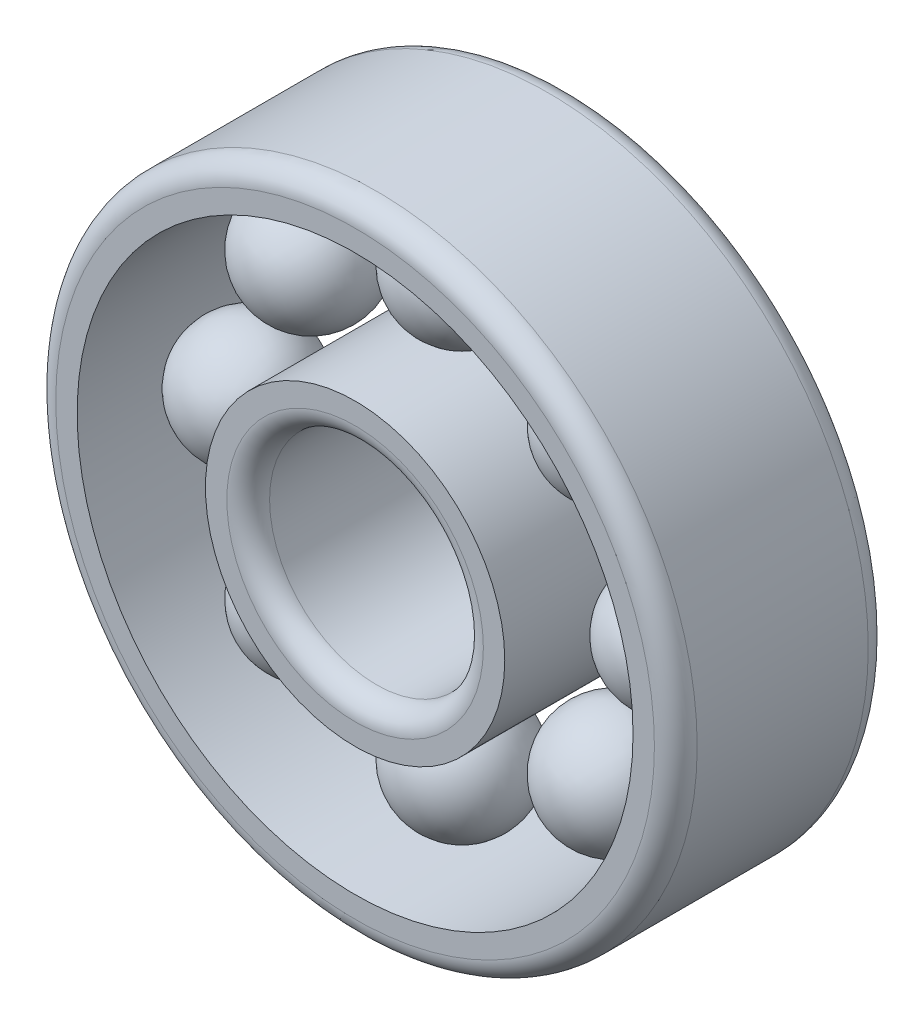
ISO-10303-21;
HEADER;
FILE_DESCRIPTION(('STEP AP214'),'2;1');
FILE_NAME('part.step','',(''),(''),'','','');
FILE_SCHEMA(('AUTOMOTIVE_DESIGN { 1 0 10303 214 1 1 1 1 }'));
ENDSEC;
DATA;
#1=APPLICATION_CONTEXT('core data for automotive mechanical design processes');
#2=APPLICATION_PROTOCOL_DEFINITION('international standard','automotive_design',2000,#1);
#3=PRODUCT_CONTEXT('',#1,'mechanical');
#4=PRODUCT('Part','Part','',(#3));
#5=PRODUCT_RELATED_PRODUCT_CATEGORY('part','',(#4));
#6=PRODUCT_DEFINITION_FORMATION('','',#4);
#7=PRODUCT_DEFINITION_CONTEXT('part definition',#1,'design');
#8=PRODUCT_DEFINITION('design','',#6,#7);
#9=PRODUCT_DEFINITION_SHAPE('','',#8);
#10=(LENGTH_UNIT() NAMED_UNIT(*) SI_UNIT(.MILLI.,.METRE.));
#11=(NAMED_UNIT(*) PLANE_ANGLE_UNIT() SI_UNIT($,.RADIAN.));
#12=(NAMED_UNIT(*) SI_UNIT($,.STERADIAN.) SOLID_ANGLE_UNIT());
#13=UNCERTAINTY_MEASURE_WITH_UNIT(LENGTH_MEASURE(1.E-05),#10,'distance_accuracy_value','');
#14=(GEOMETRIC_REPRESENTATION_CONTEXT(3) GLOBAL_UNCERTAINTY_ASSIGNED_CONTEXT((#13)) GLOBAL_UNIT_ASSIGNED_CONTEXT((#10,
#11,#12)) REPRESENTATION_CONTEXT('',''));
#15=CARTESIAN_POINT('',(0.,0.,0.));
#16=DIRECTION('',(0.,0.,1.));
#17=DIRECTION('',(1.,0.,0.));
#18=AXIS2_PLACEMENT_3D('',#15,#16,#17);
#19=CARTESIAN_POINT('',(0.707106781186547,-0.707106781186548,0.));
#20=DIRECTION('',(-0.707106781186547,0.707106781186548,0.));
#21=DIRECTION('',(0.,0.,-1.));
#22=AXIS2_PLACEMENT_3D('',#19,#20,#21);
#23=SPHERICAL_SURFACE('',#22,0.285);
#24=CARTESIAN_POINT('',(0.505581348548382,-0.505581348548382,0.));
#25=VERTEX_POINT('',#24);
#26=VERTEX_LOOP('',#25);
#27=FACE_BOUND('',#26,.T.);
#28=ADVANCED_FACE('F38',(#27),#23,.T.);
#29=CLOSED_SHELL('',(#28));
#30=MANIFOLD_SOLID_BREP('B2',#29);
#31=CARTESIAN_POINT('',(0.,-1.,0.));
#32=DIRECTION('',(0.,1.,0.));
#33=DIRECTION('',(0.,0.,-1.));
#34=AXIS2_PLACEMENT_3D('',#31,#32,#33);
#35=SPHERICAL_SURFACE('',#34,0.285);
#36=CARTESIAN_POINT('',(0.,-0.715,0.));
#37=VERTEX_POINT('',#36);
#38=VERTEX_LOOP('',#37);
#39=FACE_BOUND('',#38,.T.);
#40=ADVANCED_FACE('F57',(#39),#35,.T.);
#41=CLOSED_SHELL('',(#40));
#42=MANIFOLD_SOLID_BREP('B6',#41);
#43=CARTESIAN_POINT('',(-0.707106781186548,-0.707106781186547,0.));
#44=DIRECTION('',(0.707106781186548,0.707106781186547,0.));
#45=DIRECTION('',(0.,0.,-1.));
#46=AXIS2_PLACEMENT_3D('',#43,#44,#45);
#47=SPHERICAL_SURFACE('',#46,0.285);
#48=CARTESIAN_POINT('',(-0.505581348548382,-0.505581348548382,0.));
#49=VERTEX_POINT('',#48);
#50=VERTEX_LOOP('',#49);
#51=FACE_BOUND('',#50,.T.);
#52=ADVANCED_FACE('F76',(#51),#47,.T.);
#53=CLOSED_SHELL('',(#52));
#54=MANIFOLD_SOLID_BREP('B34',#53);
#55=CARTESIAN_POINT('',(-1.,0.,0.));
#56=DIRECTION('',(1.,0.,0.));
#57=DIRECTION('',(0.,0.,-1.));
#58=AXIS2_PLACEMENT_3D('',#55,#56,#57);
#59=SPHERICAL_SURFACE('',#58,0.285);
#60=CARTESIAN_POINT('',(-0.715,0.,0.));
#61=VERTEX_POINT('',#60);
#62=VERTEX_LOOP('',#61);
#63=FACE_BOUND('',#62,.T.);
#64=ADVANCED_FACE('F95',(#63),#59,.T.);
#65=CLOSED_SHELL('',(#64));
#66=MANIFOLD_SOLID_BREP('B53',#65);
#67=CARTESIAN_POINT('',(-0.707106781186547,0.707106781186548,0.));
#68=DIRECTION('',(0.707106781186547,-0.707106781186548,0.));
#69=DIRECTION('',(0.,0.,-1.));
#70=AXIS2_PLACEMENT_3D('',#67,#68,#69);
#71=SPHERICAL_SURFACE('',#70,0.285);
#72=CARTESIAN_POINT('',(-0.505581348548382,0.505581348548382,0.));
#73=VERTEX_POINT('',#72);
#74=VERTEX_LOOP('',#73);
#75=FACE_BOUND('',#74,.T.);
#76=ADVANCED_FACE('F114',(#75),#71,.T.);
#77=CLOSED_SHELL('',(#76));
#78=MANIFOLD_SOLID_BREP('B72',#77);
#79=CARTESIAN_POINT('',(0.,1.,0.));
#80=DIRECTION('',(0.,-1.,0.));
#81=DIRECTION('',(0.,0.,-1.));
#82=AXIS2_PLACEMENT_3D('',#79,#80,#81);
#83=SPHERICAL_SURFACE('',#82,0.285);
#84=CARTESIAN_POINT('',(0.,0.715,0.));
#85=VERTEX_POINT('',#84);
#86=VERTEX_LOOP('',#85);
#87=FACE_BOUND('',#86,.T.);
#88=ADVANCED_FACE('F133',(#87),#83,.T.);
#89=CLOSED_SHELL('',(#88));
#90=MANIFOLD_SOLID_BREP('B91',#89);
#91=CARTESIAN_POINT('',(0.707106781186548,0.707106781186548,0.));
#92=DIRECTION('',(-0.707106781186548,-0.707106781186548,0.));
#93=DIRECTION('',(0.,0.,-1.));
#94=AXIS2_PLACEMENT_3D('',#91,#92,#93);
#95=SPHERICAL_SURFACE('',#94,0.285);
#96=CARTESIAN_POINT('',(0.505581348548382,0.505581348548382,0.));
#97=VERTEX_POINT('',#96);
#98=VERTEX_LOOP('',#97);
#99=FACE_BOUND('',#98,.T.);
#100=ADVANCED_FACE('F152',(#99),#95,.T.);
#101=CLOSED_SHELL('',(#100));
#102=MANIFOLD_SOLID_BREP('B110',#101);
#103=CARTESIAN_POINT('',(1.,0.,0.));
#104=DIRECTION('',(-1.,0.,0.));
#105=DIRECTION('',(0.,0.,-1.));
#106=AXIS2_PLACEMENT_3D('',#103,#104,#105);
#107=SPHERICAL_SURFACE('',#106,0.285);
#108=CARTESIAN_POINT('',(0.715,0.,0.));
#109=VERTEX_POINT('',#108);
#110=VERTEX_LOOP('',#109);
#111=FACE_BOUND('',#110,.T.);
#112=ADVANCED_FACE('F173',(#111),#107,.T.);
#113=CLOSED_SHELL('',(#112));
#114=MANIFOLD_SOLID_BREP('B129',#113);
#115=CARTESIAN_POINT('',(0.,0.,1.75));
#116=DIRECTION('',(0.,0.,1.));
#117=DIRECTION('',(1.,0.,0.));
#118=AXIS2_PLACEMENT_3D('',#115,#116,#117);
#119=CYLINDRICAL_SURFACE('',#118,1.3);
#120=CARTESIAN_POINT('',(0.,0.,0.5));
#121=DIRECTION('',(0.,0.,1.));
#122=DIRECTION('',(1.,0.,0.));
#123=AXIS2_PLACEMENT_3D('',#120,#121,#122);
#124=CIRCLE('',#123,1.3);
#125=CARTESIAN_POINT('',(1.3,0.,0.5));
#126=VERTEX_POINT('',#125);
#127=EDGE_CURVE('E213',#126,#126,#124,.T.);
#128=ORIENTED_EDGE('',*,*,#127,.T.);
#129=EDGE_LOOP('',(#128));
#130=FACE_BOUND('',#129,.T.);
#131=CARTESIAN_POINT('',(0.,0.,-0.5));
#132=DIRECTION('',(0.,0.,1.));
#133=DIRECTION('',(1.,0.,0.));
#134=AXIS2_PLACEMENT_3D('',#131,#132,#133);
#135=CIRCLE('',#134,1.3);
#136=CARTESIAN_POINT('',(1.3,0.,-0.5));
#137=VERTEX_POINT('',#136);
#138=EDGE_CURVE('E216',#137,#137,#135,.T.);
#139=ORIENTED_EDGE('',*,*,#138,.F.);
#140=EDGE_LOOP('',(#139));
#141=FACE_BOUND('',#140,.T.);
#142=ADVANCED_FACE('F193',(#130,#141),#119,.F.);
#143=CARTESIAN_POINT('',(1.3,0.,0.5));
#144=DIRECTION('',(0.,0.,1.));
#145=DIRECTION('',(1.,0.,0.));
#146=AXIS2_PLACEMENT_3D('',#143,#144,#145);
#147=PLANE('',#146);
#148=CARTESIAN_POINT('',(0.,0.,0.5));
#149=DIRECTION('',(0.,0.,1.));
#150=DIRECTION('',(1.,0.,0.));
#151=AXIS2_PLACEMENT_3D('',#148,#149,#150);
#152=CIRCLE('',#151,1.4);
#153=CARTESIAN_POINT('',(1.4,0.,0.5));
#154=VERTEX_POINT('',#153);
#155=EDGE_CURVE('E172',#154,#154,#152,.T.);
#156=ORIENTED_EDGE('',*,*,#155,.T.);
#157=EDGE_LOOP('',(#156));
#158=FACE_BOUND('',#157,.T.);
#159=ORIENTED_EDGE('',*,*,#127,.F.);
#160=EDGE_LOOP('',(#159));
#161=FACE_BOUND('',#160,.T.);
#162=ADVANCED_FACE('F223',(#158,#161),#147,.T.);
#163=CARTESIAN_POINT('',(0.,0.,1.75));
#164=DIRECTION('',(0.,0.,1.));
#165=DIRECTION('',(1.,0.,0.));
#166=AXIS2_PLACEMENT_3D('',#163,#164,#165);
#167=CYLINDRICAL_SURFACE('',#166,1.5);
#168=CARTESIAN_POINT('',(0.,0.,-0.4));
#169=DIRECTION('',(0.,0.,-1.));
#170=DIRECTION('',(-1.,0.,0.));
#171=AXIS2_PLACEMENT_3D('',#168,#169,#170);
#172=CIRCLE('',#171,1.5);
#173=CARTESIAN_POINT('',(-1.5,0.,-0.4));
#174=VERTEX_POINT('',#173);
#175=EDGE_CURVE('E204',#174,#174,#172,.F.);
#176=ORIENTED_EDGE('',*,*,#175,.T.);
#177=EDGE_LOOP('',(#176));
#178=FACE_BOUND('',#177,.T.);
#179=CARTESIAN_POINT('',(0.,0.,0.4));
#180=DIRECTION('',(0.,0.,1.));
#181=DIRECTION('',(1.,0.,0.));
#182=AXIS2_PLACEMENT_3D('',#179,#180,#181);
#183=CIRCLE('',#182,1.5);
#184=CARTESIAN_POINT('',(1.5,0.,0.4));
#185=VERTEX_POINT('',#184);
#186=EDGE_CURVE('E208',#185,#185,#183,.F.);
#187=ORIENTED_EDGE('',*,*,#186,.T.);
#188=EDGE_LOOP('',(#187));
#189=FACE_BOUND('',#188,.T.);
#190=ADVANCED_FACE('F229',(#178,#189),#167,.T.);
#191=CARTESIAN_POINT('',(1.5,0.,-0.5));
#192=DIRECTION('',(0.,0.,-1.));
#193=DIRECTION('',(-1.,0.,0.));
#194=AXIS2_PLACEMENT_3D('',#191,#192,#193);
#195=PLANE('',#194);
#196=CARTESIAN_POINT('',(0.,0.,-0.5));
#197=DIRECTION('',(0.,0.,-1.));
#198=DIRECTION('',(-1.,0.,0.));
#199=AXIS2_PLACEMENT_3D('',#196,#197,#198);
#200=CIRCLE('',#199,1.4);
#201=CARTESIAN_POINT('',(-1.4,0.,-0.5));
#202=VERTEX_POINT('',#201);
#203=EDGE_CURVE('E200',#202,#202,#200,.T.);
#204=ORIENTED_EDGE('',*,*,#203,.T.);
#205=EDGE_LOOP('',(#204));
#206=FACE_BOUND('',#205,.T.);
#207=ORIENTED_EDGE('',*,*,#138,.T.);
#208=EDGE_LOOP('',(#207));
#209=FACE_BOUND('',#208,.T.);
#210=ADVANCED_FACE('F220',(#206,#209),#195,.T.);
#211=CARTESIAN_POINT('',(0.,0.,-0.4));
#212=DIRECTION('',(0.,0.,-1.));
#213=DIRECTION('',(-1.,0.,0.));
#214=AXIS2_PLACEMENT_3D('',#211,#212,#213);
#215=TOROIDAL_SURFACE('',#214,1.4,0.1);
#216=ORIENTED_EDGE('',*,*,#203,.F.);
#217=EDGE_LOOP('',(#216));
#218=FACE_BOUND('',#217,.T.);
#219=ORIENTED_EDGE('',*,*,#175,.F.);
#220=EDGE_LOOP('',(#219));
#221=FACE_BOUND('',#220,.T.);
#222=ADVANCED_FACE('F232',(#218,#221),#215,.T.);
#223=CARTESIAN_POINT('',(0.,0.,0.4));
#224=DIRECTION('',(0.,0.,1.));
#225=DIRECTION('',(1.,0.,0.));
#226=AXIS2_PLACEMENT_3D('',#223,#224,#225);
#227=TOROIDAL_SURFACE('',#226,1.4,0.1);
#228=ORIENTED_EDGE('',*,*,#186,.F.);
#229=EDGE_LOOP('',(#228));
#230=FACE_BOUND('',#229,.T.);
#231=ORIENTED_EDGE('',*,*,#155,.F.);
#232=EDGE_LOOP('',(#231));
#233=FACE_BOUND('',#232,.T.);
#234=ADVANCED_FACE('F195',(#230,#233),#227,.T.);
#235=CLOSED_SHELL('',(#142,#162,#190,#210,#222,#234));
#236=MANIFOLD_SOLID_BREP('B148',#235);
#237=CARTESIAN_POINT('',(0.,0.,1.75));
#238=DIRECTION('',(0.,0.,1.));
#239=DIRECTION('',(1.,0.,0.));
#240=AXIS2_PLACEMENT_3D('',#237,#238,#239);
#241=CYLINDRICAL_SURFACE('',#240,0.5);
#242=CARTESIAN_POINT('',(0.,0.,-0.4));
#243=DIRECTION('',(0.,0.,-1.));
#244=DIRECTION('',(-1.,0.,0.));
#245=AXIS2_PLACEMENT_3D('',#242,#243,#244);
#246=CIRCLE('',#245,0.5);
#247=CARTESIAN_POINT('',(-0.5,0.,-0.4));
#248=VERTEX_POINT('',#247);
#249=EDGE_CURVE('E292',#248,#248,#246,.T.);
#250=ORIENTED_EDGE('',*,*,#249,.T.);
#251=EDGE_LOOP('',(#250));
#252=FACE_BOUND('',#251,.T.);
#253=CARTESIAN_POINT('',(0.,0.,0.4));
#254=DIRECTION('',(0.,0.,1.));
#255=DIRECTION('',(1.,0.,0.));
#256=AXIS2_PLACEMENT_3D('',#253,#254,#255);
#257=CIRCLE('',#256,0.5);
#258=CARTESIAN_POINT('',(0.5,0.,0.4));
#259=VERTEX_POINT('',#258);
#260=EDGE_CURVE('E296',#259,#259,#257,.T.);
#261=ORIENTED_EDGE('',*,*,#260,.T.);
#262=EDGE_LOOP('',(#261));
#263=FACE_BOUND('',#262,.T.);
#264=ADVANCED_FACE('F285',(#252,#263),#241,.F.);
#265=CARTESIAN_POINT('',(0.5,0.,0.5));
#266=DIRECTION('',(0.,0.,1.));
#267=DIRECTION('',(1.,0.,0.));
#268=AXIS2_PLACEMENT_3D('',#265,#266,#267);
#269=PLANE('',#268);
#270=CARTESIAN_POINT('',(0.,0.,0.5));
#271=DIRECTION('',(0.,0.,1.));
#272=DIRECTION('',(1.,0.,0.));
#273=AXIS2_PLACEMENT_3D('',#270,#271,#272);
#274=CIRCLE('',#273,0.6);
#275=CARTESIAN_POINT('',(0.6,0.,0.5));
#276=VERTEX_POINT('',#275);
#277=EDGE_CURVE('E192',#276,#276,#274,.F.);
#278=ORIENTED_EDGE('',*,*,#277,.T.);
#279=EDGE_LOOP('',(#278));
#280=FACE_BOUND('',#279,.T.);
#281=CARTESIAN_POINT('',(0.,0.,0.5));
#282=DIRECTION('',(0.,0.,1.));
#283=DIRECTION('',(1.,0.,0.));
#284=AXIS2_PLACEMENT_3D('',#281,#282,#283);
#285=CIRCLE('',#284,0.7);
#286=CARTESIAN_POINT('',(0.7,0.,0.5));
#287=VERTEX_POINT('',#286);
#288=EDGE_CURVE('E305',#287,#287,#285,.T.);
#289=ORIENTED_EDGE('',*,*,#288,.T.);
#290=EDGE_LOOP('',(#289));
#291=FACE_BOUND('',#290,.T.);
#292=ADVANCED_FACE('F325',(#280,#291),#269,.T.);
#293=CARTESIAN_POINT('',(0.,0.,1.75));
#294=DIRECTION('',(0.,0.,1.));
#295=DIRECTION('',(1.,0.,0.));
#296=AXIS2_PLACEMENT_3D('',#293,#294,#295);
#297=CYLINDRICAL_SURFACE('',#296,0.7);
#298=CARTESIAN_POINT('',(0.,0.,-0.5));
#299=DIRECTION('',(0.,0.,1.));
#300=DIRECTION('',(1.,0.,0.));
#301=AXIS2_PLACEMENT_3D('',#298,#299,#300);
#302=CIRCLE('',#301,0.7);
#303=CARTESIAN_POINT('',(0.7,0.,-0.5));
#304=VERTEX_POINT('',#303);
#305=EDGE_CURVE('E308',#304,#304,#302,.T.);
#306=ORIENTED_EDGE('',*,*,#305,.T.);
#307=EDGE_LOOP('',(#306));
#308=FACE_BOUND('',#307,.T.);
#309=ORIENTED_EDGE('',*,*,#288,.F.);
#310=EDGE_LOOP('',(#309));
#311=FACE_BOUND('',#310,.T.);
#312=ADVANCED_FACE('F312',(#308,#311),#297,.T.);
#313=CARTESIAN_POINT('',(0.7,0.,-0.5));
#314=DIRECTION('',(0.,0.,-1.));
#315=DIRECTION('',(-1.,0.,0.));
#316=AXIS2_PLACEMENT_3D('',#313,#314,#315);
#317=PLANE('',#316);
#318=CARTESIAN_POINT('',(0.,0.,-0.5));
#319=DIRECTION('',(0.,0.,-1.));
#320=DIRECTION('',(-1.,0.,0.));
#321=AXIS2_PLACEMENT_3D('',#318,#319,#320);
#322=CIRCLE('',#321,0.6);
#323=CARTESIAN_POINT('',(-0.6,0.,-0.5));
#324=VERTEX_POINT('',#323);
#325=EDGE_CURVE('E300',#324,#324,#322,.F.);
#326=ORIENTED_EDGE('',*,*,#325,.T.);
#327=EDGE_LOOP('',(#326));
#328=FACE_BOUND('',#327,.T.);
#329=ORIENTED_EDGE('',*,*,#305,.F.);
#330=EDGE_LOOP('',(#329));
#331=FACE_BOUND('',#330,.T.);
#332=ADVANCED_FACE('F315',(#328,#331),#317,.T.);
#333=CARTESIAN_POINT('',(0.,0.,-0.4));
#334=DIRECTION('',(0.,0.,-1.));
#335=DIRECTION('',(-1.,0.,0.));
#336=AXIS2_PLACEMENT_3D('',#333,#334,#335);
#337=TOROIDAL_SURFACE('',#336,0.6,0.1);
#338=ORIENTED_EDGE('',*,*,#249,.F.);
#339=EDGE_LOOP('',(#338));
#340=FACE_BOUND('',#339,.T.);
#341=ORIENTED_EDGE('',*,*,#325,.F.);
#342=EDGE_LOOP('',(#341));
#343=FACE_BOUND('',#342,.T.);
#344=ADVANCED_FACE('F317',(#340,#343),#337,.T.);
#345=CARTESIAN_POINT('',(0.,0.,0.4));
#346=DIRECTION('',(0.,0.,1.));
#347=DIRECTION('',(1.,0.,0.));
#348=AXIS2_PLACEMENT_3D('',#345,#346,#347);
#349=TOROIDAL_SURFACE('',#348,0.6,0.1);
#350=ORIENTED_EDGE('',*,*,#277,.F.);
#351=EDGE_LOOP('',(#350));
#352=FACE_BOUND('',#351,.T.);
#353=ORIENTED_EDGE('',*,*,#260,.F.);
#354=EDGE_LOOP('',(#353));
#355=FACE_BOUND('',#354,.T.);
#356=ADVANCED_FACE('F287',(#352,#355),#349,.T.);
#357=CLOSED_SHELL('',(#264,#292,#312,#332,#344,#356));
#358=MANIFOLD_SOLID_BREP('B167',#357);
#359=ADVANCED_BREP_SHAPE_REPRESENTATION('',(#18,#30,#42,#54,#66,#78,#90,#102,#114,#236,#358),#14);
#360=SHAPE_DEFINITION_REPRESENTATION(#9,#359);
ENDSEC;
END-ISO-10303-21;
